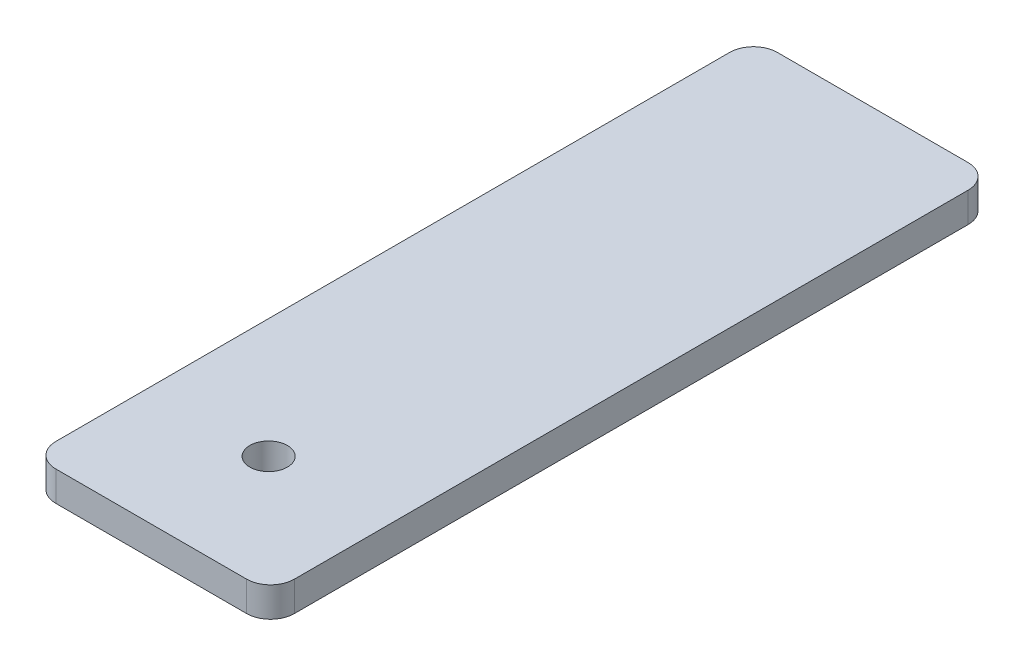
ISO-10303-21;
HEADER;
FILE_DESCRIPTION(('STEP AP214'),'2;1');
FILE_NAME('part.step','',(''),(''),'','','');
FILE_SCHEMA(('AUTOMOTIVE_DESIGN { 1 0 10303 214 1 1 1 1 }'));
ENDSEC;
DATA;
#1=APPLICATION_CONTEXT('core data for automotive mechanical design processes');
#2=APPLICATION_PROTOCOL_DEFINITION('international standard','automotive_design',2000,#1);
#3=PRODUCT_CONTEXT('',#1,'mechanical');
#4=PRODUCT('Part','Part','',(#3));
#5=PRODUCT_RELATED_PRODUCT_CATEGORY('part','',(#4));
#6=PRODUCT_DEFINITION_FORMATION('','',#4);
#7=PRODUCT_DEFINITION_CONTEXT('part definition',#1,'design');
#8=PRODUCT_DEFINITION('design','',#6,#7);
#9=PRODUCT_DEFINITION_SHAPE('','',#8);
#10=(LENGTH_UNIT() NAMED_UNIT(*) SI_UNIT(.MILLI.,.METRE.));
#11=(NAMED_UNIT(*) PLANE_ANGLE_UNIT() SI_UNIT($,.RADIAN.));
#12=(NAMED_UNIT(*) SI_UNIT($,.STERADIAN.) SOLID_ANGLE_UNIT());
#13=UNCERTAINTY_MEASURE_WITH_UNIT(LENGTH_MEASURE(1.E-05),#10,'distance_accuracy_value','');
#14=(GEOMETRIC_REPRESENTATION_CONTEXT(3) GLOBAL_UNCERTAINTY_ASSIGNED_CONTEXT((#13)) GLOBAL_UNIT_ASSIGNED_CONTEXT((#10,
#11,#12)) REPRESENTATION_CONTEXT('',''));
#15=CARTESIAN_POINT('',(0.,0.,0.));
#16=DIRECTION('',(0.,0.,1.));
#17=DIRECTION('',(1.,0.,0.));
#18=AXIS2_PLACEMENT_3D('',#15,#16,#17);
#19=CARTESIAN_POINT('',(-26.2810810810811,3.175,20.6087837837838));
#20=DIRECTION('',(1.,0.,0.));
#21=DIRECTION('',(0.,0.,-1.));
#22=AXIS2_PLACEMENT_3D('',#19,#20,#21);
#23=PLANE('',#22);
#24=DIRECTION('',(0.,0.,1.));
#25=VECTOR('',#24,1.);
#26=CARTESIAN_POINT('',(-26.2810810810811,3.175,20.6087837837838));
#27=LINE('',#26,#25);
#28=CARTESIAN_POINT('',(-26.2810810810811,3.175,-53.6762162162162));
#29=VERTEX_POINT('',#28);
#30=CARTESIAN_POINT('',(-26.2810810810811,3.175,18.0687837837838));
#31=VERTEX_POINT('',#30);
#32=EDGE_CURVE('E125',#29,#31,#27,.T.);
#33=ORIENTED_EDGE('',*,*,#32,.F.);
#34=DIRECTION('',(0.,-1.,0.));
#35=VECTOR('',#34,1.);
#36=CARTESIAN_POINT('',(-26.2810810810811,3.175,-53.6762162162162));
#37=LINE('',#36,#35);
#38=CARTESIAN_POINT('',(-26.2810810810811,0.,-53.6762162162162));
#39=VERTEX_POINT('',#38);
#40=EDGE_CURVE('E110',#29,#39,#37,.T.);
#41=ORIENTED_EDGE('',*,*,#40,.T.);
#42=DIRECTION('',(0.,0.,1.));
#43=VECTOR('',#42,1.);
#44=CARTESIAN_POINT('',(-26.2810810810811,0.,20.6087837837838));
#45=LINE('',#44,#43);
#46=CARTESIAN_POINT('',(-26.2810810810811,0.,18.0687837837838));
#47=VERTEX_POINT('',#46);
#48=EDGE_CURVE('E122',#39,#47,#45,.T.);
#49=ORIENTED_EDGE('',*,*,#48,.T.);
#50=DIRECTION('',(0.,-1.,0.));
#51=VECTOR('',#50,1.);
#52=CARTESIAN_POINT('',(-26.2810810810811,3.175,18.0687837837838));
#53=LINE('',#52,#51);
#54=EDGE_CURVE('E127',#47,#31,#53,.F.);
#55=ORIENTED_EDGE('',*,*,#54,.T.);
#56=EDGE_LOOP('',(#33,#41,#49,#55));
#57=FACE_BOUND('',#56,.T.);
#58=ADVANCED_FACE('F40',(#57),#23,.F.);
#59=CARTESIAN_POINT('',(-26.2810810810811,3.175,20.6087837837838));
#60=DIRECTION('',(0.,0.,-1.));
#61=DIRECTION('',(-1.,0.,0.));
#62=AXIS2_PLACEMENT_3D('',#59,#60,#61);
#63=PLANE('',#62);
#64=DIRECTION('',(1.,0.,0.));
#65=VECTOR('',#64,1.);
#66=CARTESIAN_POINT('',(-26.2810810810811,0.,20.6087837837838));
#67=LINE('',#66,#65);
#68=CARTESIAN_POINT('',(-23.7410810810811,0.,20.6087837837838));
#69=VERTEX_POINT('',#68);
#70=CARTESIAN_POINT('',(-3.42108108108108,0.,20.6087837837838));
#71=VERTEX_POINT('',#70);
#72=EDGE_CURVE('E131',#69,#71,#67,.T.);
#73=ORIENTED_EDGE('',*,*,#72,.T.);
#74=DIRECTION('',(0.,-1.,0.));
#75=VECTOR('',#74,1.);
#76=CARTESIAN_POINT('',(-3.42108108108108,3.175,20.6087837837838));
#77=LINE('',#76,#75);
#78=CARTESIAN_POINT('',(-3.42108108108108,3.175,20.6087837837838));
#79=VERTEX_POINT('',#78);
#80=EDGE_CURVE('E11',#71,#79,#77,.F.);
#81=ORIENTED_EDGE('',*,*,#80,.T.);
#82=DIRECTION('',(1.,0.,0.));
#83=VECTOR('',#82,1.);
#84=CARTESIAN_POINT('',(-26.2810810810811,3.175,20.6087837837838));
#85=LINE('',#84,#83);
#86=CARTESIAN_POINT('',(-23.7410810810811,3.175,20.6087837837838));
#87=VERTEX_POINT('',#86);
#88=EDGE_CURVE('E171',#87,#79,#85,.T.);
#89=ORIENTED_EDGE('',*,*,#88,.F.);
#90=DIRECTION('',(0.,-1.,0.));
#91=VECTOR('',#90,1.);
#92=CARTESIAN_POINT('',(-23.7410810810811,3.175,20.6087837837838));
#93=LINE('',#92,#91);
#94=EDGE_CURVE('E48',#87,#69,#93,.T.);
#95=ORIENTED_EDGE('',*,*,#94,.T.);
#96=EDGE_LOOP('',(#73,#81,#89,#95));
#97=FACE_BOUND('',#96,.T.);
#98=ADVANCED_FACE('F169',(#97),#63,.F.);
#99=CARTESIAN_POINT('',(-0.881081081081075,3.175,20.6087837837838));
#100=DIRECTION('',(-1.,0.,0.));
#101=DIRECTION('',(0.,0.,1.));
#102=AXIS2_PLACEMENT_3D('',#99,#100,#101);
#103=PLANE('',#102);
#104=DIRECTION('',(0.,0.,-1.));
#105=VECTOR('',#104,1.);
#106=CARTESIAN_POINT('',(-0.881081081081075,0.,20.6087837837838));
#107=LINE('',#106,#105);
#108=CARTESIAN_POINT('',(-0.881081081081075,0.,18.0687837837838));
#109=VERTEX_POINT('',#108);
#110=CARTESIAN_POINT('',(-0.881081081081078,0.,-53.6762162162162));
#111=VERTEX_POINT('',#110);
#112=EDGE_CURVE('E135',#109,#111,#107,.T.);
#113=ORIENTED_EDGE('',*,*,#112,.T.);
#114=DIRECTION('',(0.,-1.,0.));
#115=VECTOR('',#114,1.);
#116=CARTESIAN_POINT('',(-0.881081081081078,3.175,-53.6762162162162));
#117=LINE('',#116,#115);
#118=CARTESIAN_POINT('',(-0.881081081081078,3.175,-53.6762162162162));
#119=VERTEX_POINT('',#118);
#120=EDGE_CURVE('E55',#111,#119,#117,.F.);
#121=ORIENTED_EDGE('',*,*,#120,.T.);
#122=DIRECTION('',(0.,0.,-1.));
#123=VECTOR('',#122,1.);
#124=CARTESIAN_POINT('',(-0.881081081081075,3.175,20.6087837837838));
#125=LINE('',#124,#123);
#126=CARTESIAN_POINT('',(-0.881081081081075,3.175,18.0687837837838));
#127=VERTEX_POINT('',#126);
#128=EDGE_CURVE('E179',#127,#119,#125,.T.);
#129=ORIENTED_EDGE('',*,*,#128,.F.);
#130=DIRECTION('',(0.,-1.,0.));
#131=VECTOR('',#130,1.);
#132=CARTESIAN_POINT('',(-0.881081081081075,3.175,18.0687837837838));
#133=LINE('',#132,#131);
#134=EDGE_CURVE('E162',#127,#109,#133,.T.);
#135=ORIENTED_EDGE('',*,*,#134,.T.);
#136=EDGE_LOOP('',(#113,#121,#129,#135));
#137=FACE_BOUND('',#136,.T.);
#138=ADVANCED_FACE('F178',(#137),#103,.F.);
#139=CARTESIAN_POINT('',(-26.2810810810811,3.175,-56.2162162162162));
#140=DIRECTION('',(0.,0.,1.));
#141=DIRECTION('',(1.,0.,0.));
#142=AXIS2_PLACEMENT_3D('',#139,#140,#141);
#143=PLANE('',#142);
#144=DIRECTION('',(-1.,0.,0.));
#145=VECTOR('',#144,1.);
#146=CARTESIAN_POINT('',(-26.2810810810811,0.,-56.2162162162162));
#147=LINE('',#146,#145);
#148=CARTESIAN_POINT('',(-3.42108108108108,0.,-56.2162162162162));
#149=VERTEX_POINT('',#148);
#150=CARTESIAN_POINT('',(-23.7410810810811,0.,-56.2162162162162));
#151=VERTEX_POINT('',#150);
#152=EDGE_CURVE('E145',#149,#151,#147,.T.);
#153=ORIENTED_EDGE('',*,*,#152,.T.);
#154=DIRECTION('',(0.,-1.,0.));
#155=VECTOR('',#154,1.);
#156=CARTESIAN_POINT('',(-23.7410810810811,3.175,-56.2162162162162));
#157=LINE('',#156,#155);
#158=CARTESIAN_POINT('',(-23.7410810810811,3.175,-56.2162162162162));
#159=VERTEX_POINT('',#158);
#160=EDGE_CURVE('E111',#151,#159,#157,.F.);
#161=ORIENTED_EDGE('',*,*,#160,.T.);
#162=DIRECTION('',(-1.,0.,0.));
#163=VECTOR('',#162,1.);
#164=CARTESIAN_POINT('',(-26.2810810810811,3.175,-56.2162162162162));
#165=LINE('',#164,#163);
#166=CARTESIAN_POINT('',(-3.42108108108108,3.175,-56.2162162162162));
#167=VERTEX_POINT('',#166);
#168=EDGE_CURVE('E141',#167,#159,#165,.T.);
#169=ORIENTED_EDGE('',*,*,#168,.F.);
#170=DIRECTION('',(0.,-1.,0.));
#171=VECTOR('',#170,1.);
#172=CARTESIAN_POINT('',(-3.42108108108108,3.175,-56.2162162162162));
#173=LINE('',#172,#171);
#174=EDGE_CURVE('E116',#167,#149,#173,.T.);
#175=ORIENTED_EDGE('',*,*,#174,.T.);
#176=EDGE_LOOP('',(#153,#161,#169,#175));
#177=FACE_BOUND('',#176,.T.);
#178=ADVANCED_FACE('F192',(#177),#143,.F.);
#179=CARTESIAN_POINT('',(0.,3.175,0.));
#180=DIRECTION('',(0.,-1.,0.));
#181=DIRECTION('',(0.,0.,-1.));
#182=AXIS2_PLACEMENT_3D('',#179,#180,#181);
#183=PLANE('',#182);
#184=CARTESIAN_POINT('',(-13.5810810810811,3.175,8.10878378378379));
#185=DIRECTION('',(0.,1.,0.));
#186=DIRECTION('',(0.,0.,1.));
#187=AXIS2_PLACEMENT_3D('',#184,#185,#186);
#188=CIRCLE('',#187,2.);
#189=CARTESIAN_POINT('',(-13.5810810810811,3.175,10.1087837837838));
#190=VERTEX_POINT('',#189);
#191=EDGE_CURVE('E138',#190,#190,#188,.T.);
#192=ORIENTED_EDGE('',*,*,#191,.F.);
#193=EDGE_LOOP('',(#192));
#194=FACE_BOUND('',#193,.T.);
#195=ORIENTED_EDGE('',*,*,#168,.T.);
#196=CARTESIAN_POINT('',(-23.7410810810811,3.175,-53.6762162162162));
#197=DIRECTION('',(0.,-1.,0.));
#198=DIRECTION('',(0.,0.,-1.));
#199=AXIS2_PLACEMENT_3D('',#196,#197,#198);
#200=CIRCLE('',#199,2.54);
#201=EDGE_CURVE('E160',#159,#29,#200,.F.);
#202=ORIENTED_EDGE('',*,*,#201,.T.);
#203=ORIENTED_EDGE('',*,*,#32,.T.);
#204=CARTESIAN_POINT('',(-23.7410810810811,3.175,18.0687837837838));
#205=DIRECTION('',(0.,-1.,0.));
#206=DIRECTION('',(0.,0.,-1.));
#207=AXIS2_PLACEMENT_3D('',#204,#205,#206);
#208=CIRCLE('',#207,2.54);
#209=EDGE_CURVE('E155',#31,#87,#208,.F.);
#210=ORIENTED_EDGE('',*,*,#209,.T.);
#211=ORIENTED_EDGE('',*,*,#88,.T.);
#212=CARTESIAN_POINT('',(-3.42108108108107,3.175,18.0687837837838));
#213=DIRECTION('',(0.,-1.,0.));
#214=DIRECTION('',(0.,0.,-1.));
#215=AXIS2_PLACEMENT_3D('',#212,#213,#214);
#216=CIRCLE('',#215,2.54);
#217=EDGE_CURVE('E62',#79,#127,#216,.F.);
#218=ORIENTED_EDGE('',*,*,#217,.T.);
#219=ORIENTED_EDGE('',*,*,#128,.T.);
#220=CARTESIAN_POINT('',(-3.42108108108108,3.175,-53.6762162162162));
#221=DIRECTION('',(0.,-1.,0.));
#222=DIRECTION('',(0.,0.,-1.));
#223=AXIS2_PLACEMENT_3D('',#220,#221,#222);
#224=CIRCLE('',#223,2.54);
#225=EDGE_CURVE('E158',#119,#167,#224,.F.);
#226=ORIENTED_EDGE('',*,*,#225,.T.);
#227=EDGE_LOOP('',(#195,#202,#203,#210,#211,#218,#219,#226));
#228=FACE_BOUND('',#227,.T.);
#229=ADVANCED_FACE('F190',(#194,#228),#183,.F.);
#230=CARTESIAN_POINT('',(0.,0.,0.));
#231=DIRECTION('',(0.,-1.,0.));
#232=DIRECTION('',(0.,0.,-1.));
#233=AXIS2_PLACEMENT_3D('',#230,#231,#232);
#234=PLANE('',#233);
#235=CARTESIAN_POINT('',(-13.5810810810811,0.,8.10878378378379));
#236=DIRECTION('',(0.,1.,0.));
#237=DIRECTION('',(0.,0.,1.));
#238=AXIS2_PLACEMENT_3D('',#235,#236,#237);
#239=CIRCLE('',#238,2.);
#240=CARTESIAN_POINT('',(-13.5810810810811,0.,10.1087837837838));
#241=VERTEX_POINT('',#240);
#242=EDGE_CURVE('E132',#241,#241,#239,.T.);
#243=ORIENTED_EDGE('',*,*,#242,.T.);
#244=EDGE_LOOP('',(#243));
#245=FACE_BOUND('',#244,.T.);
#246=ORIENTED_EDGE('',*,*,#48,.F.);
#247=CARTESIAN_POINT('',(-23.7410810810811,0.,-53.6762162162162));
#248=DIRECTION('',(0.,-1.,0.));
#249=DIRECTION('',(0.,0.,-1.));
#250=AXIS2_PLACEMENT_3D('',#247,#248,#249);
#251=CIRCLE('',#250,2.54);
#252=EDGE_CURVE('E106',#39,#151,#251,.T.);
#253=ORIENTED_EDGE('',*,*,#252,.T.);
#254=ORIENTED_EDGE('',*,*,#152,.F.);
#255=CARTESIAN_POINT('',(-3.42108108108108,0.,-53.6762162162162));
#256=DIRECTION('',(0.,-1.,0.));
#257=DIRECTION('',(0.,0.,-1.));
#258=AXIS2_PLACEMENT_3D('',#255,#256,#257);
#259=CIRCLE('',#258,2.54);
#260=EDGE_CURVE('E117',#149,#111,#259,.T.);
#261=ORIENTED_EDGE('',*,*,#260,.T.);
#262=ORIENTED_EDGE('',*,*,#112,.F.);
#263=CARTESIAN_POINT('',(-3.42108108108107,0.,18.0687837837838));
#264=DIRECTION('',(0.,-1.,0.));
#265=DIRECTION('',(0.,0.,-1.));
#266=AXIS2_PLACEMENT_3D('',#263,#264,#265);
#267=CIRCLE('',#266,2.54);
#268=EDGE_CURVE('E149',#109,#71,#267,.T.);
#269=ORIENTED_EDGE('',*,*,#268,.T.);
#270=ORIENTED_EDGE('',*,*,#72,.F.);
#271=CARTESIAN_POINT('',(-23.7410810810811,0.,18.0687837837838));
#272=DIRECTION('',(0.,-1.,0.));
#273=DIRECTION('',(0.,0.,-1.));
#274=AXIS2_PLACEMENT_3D('',#271,#272,#273);
#275=CIRCLE('',#274,2.54);
#276=EDGE_CURVE('E126',#69,#47,#275,.T.);
#277=ORIENTED_EDGE('',*,*,#276,.T.);
#278=EDGE_LOOP('',(#246,#253,#254,#261,#262,#269,#270,#277));
#279=FACE_BOUND('',#278,.T.);
#280=ADVANCED_FACE('F129',(#245,#279),#234,.T.);
#281=CARTESIAN_POINT('',(-13.5810810810811,0.,8.10878378378379));
#282=DIRECTION('',(0.,1.,0.));
#283=DIRECTION('',(0.,0.,1.));
#284=AXIS2_PLACEMENT_3D('',#281,#282,#283);
#285=CYLINDRICAL_SURFACE('',#284,2.);
#286=ORIENTED_EDGE('',*,*,#242,.F.);
#287=EDGE_LOOP('',(#286));
#288=FACE_BOUND('',#287,.T.);
#289=ORIENTED_EDGE('',*,*,#191,.T.);
#290=EDGE_LOOP('',(#289));
#291=FACE_BOUND('',#290,.T.);
#292=ADVANCED_FACE('F188',(#288,#291),#285,.F.);
#293=CARTESIAN_POINT('',(-23.7410810810811,3.175,-53.6762162162162));
#294=DIRECTION('',(0.,-1.,0.));
#295=DIRECTION('',(0.,0.,-1.));
#296=AXIS2_PLACEMENT_3D('',#293,#294,#295);
#297=CYLINDRICAL_SURFACE('',#296,2.54);
#298=ORIENTED_EDGE('',*,*,#201,.F.);
#299=ORIENTED_EDGE('',*,*,#160,.F.);
#300=ORIENTED_EDGE('',*,*,#252,.F.);
#301=ORIENTED_EDGE('',*,*,#40,.F.);
#302=EDGE_LOOP('',(#298,#299,#300,#301));
#303=FACE_BOUND('',#302,.T.);
#304=ADVANCED_FACE('F109',(#303),#297,.T.);
#305=CARTESIAN_POINT('',(-3.42108108108108,3.175,-53.6762162162162));
#306=DIRECTION('',(0.,-1.,0.));
#307=DIRECTION('',(0.,0.,-1.));
#308=AXIS2_PLACEMENT_3D('',#305,#306,#307);
#309=CYLINDRICAL_SURFACE('',#308,2.54);
#310=ORIENTED_EDGE('',*,*,#225,.F.);
#311=ORIENTED_EDGE('',*,*,#120,.F.);
#312=ORIENTED_EDGE('',*,*,#260,.F.);
#313=ORIENTED_EDGE('',*,*,#174,.F.);
#314=EDGE_LOOP('',(#310,#311,#312,#313));
#315=FACE_BOUND('',#314,.T.);
#316=ADVANCED_FACE('F198',(#315),#309,.T.);
#317=CARTESIAN_POINT('',(-3.42108108108107,3.175,18.0687837837838));
#318=DIRECTION('',(0.,-1.,0.));
#319=DIRECTION('',(0.,0.,-1.));
#320=AXIS2_PLACEMENT_3D('',#317,#318,#319);
#321=CYLINDRICAL_SURFACE('',#320,2.54);
#322=ORIENTED_EDGE('',*,*,#217,.F.);
#323=ORIENTED_EDGE('',*,*,#80,.F.);
#324=ORIENTED_EDGE('',*,*,#268,.F.);
#325=ORIENTED_EDGE('',*,*,#134,.F.);
#326=EDGE_LOOP('',(#322,#323,#324,#325));
#327=FACE_BOUND('',#326,.T.);
#328=ADVANCED_FACE('F177',(#327),#321,.T.);
#329=CARTESIAN_POINT('',(-23.7410810810811,3.175,18.0687837837838));
#330=DIRECTION('',(0.,-1.,0.));
#331=DIRECTION('',(0.,0.,-1.));
#332=AXIS2_PLACEMENT_3D('',#329,#330,#331);
#333=CYLINDRICAL_SURFACE('',#332,2.54);
#334=ORIENTED_EDGE('',*,*,#209,.F.);
#335=ORIENTED_EDGE('',*,*,#54,.F.);
#336=ORIENTED_EDGE('',*,*,#276,.F.);
#337=ORIENTED_EDGE('',*,*,#94,.F.);
#338=EDGE_LOOP('',(#334,#335,#336,#337));
#339=FACE_BOUND('',#338,.T.);
#340=ADVANCED_FACE('F42',(#339),#333,.T.);
#341=CLOSED_SHELL('',(#58,#98,#138,#178,#229,#280,#292,#304,#316,#328,#340));
#342=MANIFOLD_SOLID_BREP('B2',#341);
#343=ADVANCED_BREP_SHAPE_REPRESENTATION('',(#18,#342),#14);
#344=SHAPE_DEFINITION_REPRESENTATION(#9,#343);
ENDSEC;
END-ISO-10303-21;
